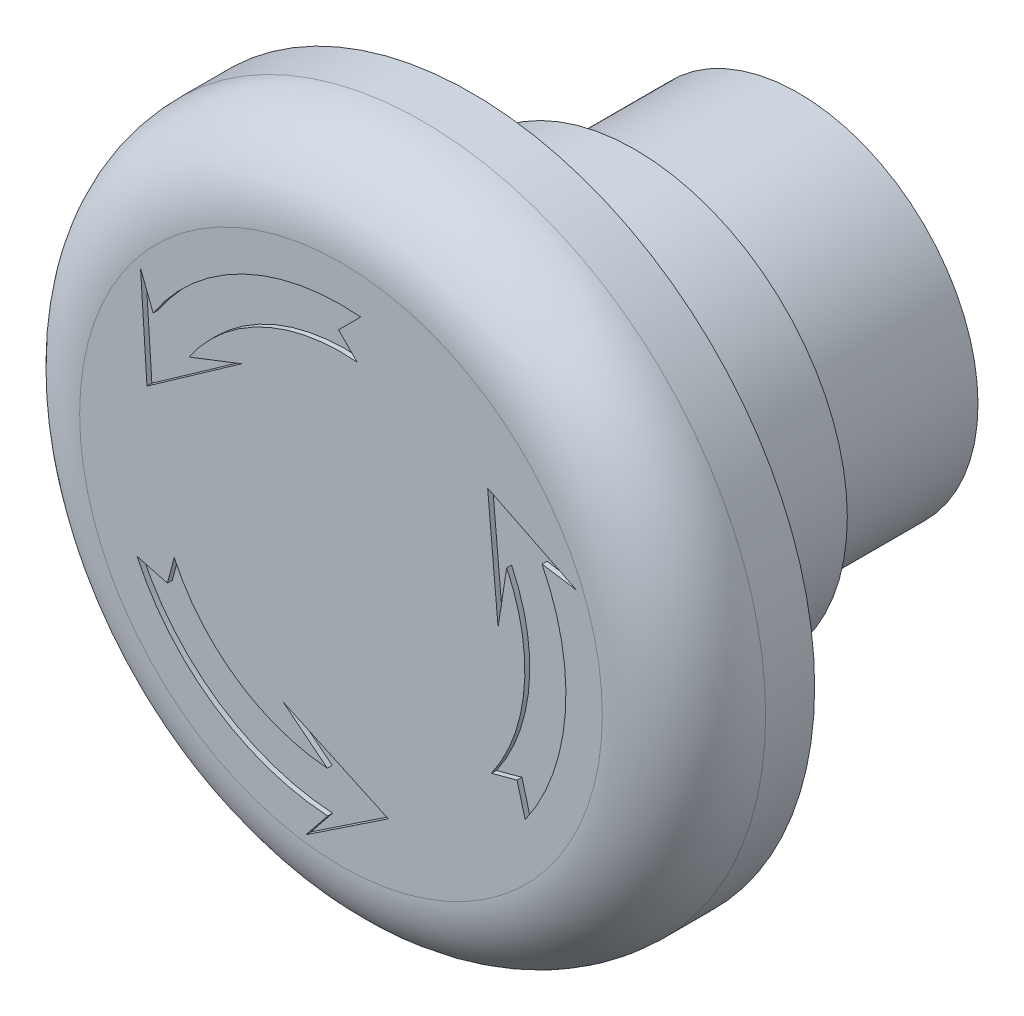
ISO-10303-21;
HEADER;
FILE_DESCRIPTION(('STEP AP214'),'2;1');
FILE_NAME('part.step','',(''),(''),'','','');
FILE_SCHEMA(('AUTOMOTIVE_DESIGN { 1 0 10303 214 1 1 1 1 }'));
ENDSEC;
DATA;
#1=APPLICATION_CONTEXT('core data for automotive mechanical design processes');
#2=APPLICATION_PROTOCOL_DEFINITION('international standard','automotive_design',2000,#1);
#3=PRODUCT_CONTEXT('',#1,'mechanical');
#4=PRODUCT('Part','Part','',(#3));
#5=PRODUCT_RELATED_PRODUCT_CATEGORY('part','',(#4));
#6=PRODUCT_DEFINITION_FORMATION('','',#4);
#7=PRODUCT_DEFINITION_CONTEXT('part definition',#1,'design');
#8=PRODUCT_DEFINITION('design','',#6,#7);
#9=PRODUCT_DEFINITION_SHAPE('','',#8);
#10=(LENGTH_UNIT() NAMED_UNIT(*) SI_UNIT(.MILLI.,.METRE.));
#11=(NAMED_UNIT(*) PLANE_ANGLE_UNIT() SI_UNIT($,.RADIAN.));
#12=(NAMED_UNIT(*) SI_UNIT($,.STERADIAN.) SOLID_ANGLE_UNIT());
#13=UNCERTAINTY_MEASURE_WITH_UNIT(LENGTH_MEASURE(1.E-05),#10,'distance_accuracy_value','');
#14=(GEOMETRIC_REPRESENTATION_CONTEXT(3) GLOBAL_UNCERTAINTY_ASSIGNED_CONTEXT((#13)) GLOBAL_UNIT_ASSIGNED_CONTEXT((#10,
#11,#12)) REPRESENTATION_CONTEXT('',''));
#15=CARTESIAN_POINT('',(0.,0.,0.));
#16=DIRECTION('',(0.,0.,1.));
#17=DIRECTION('',(1.,0.,0.));
#18=AXIS2_PLACEMENT_3D('',#15,#16,#17);
#19=CARTESIAN_POINT('',(0.,0.,10.));
#20=DIRECTION('',(0.,0.,-1.));
#21=DIRECTION('',(-1.,0.,0.));
#22=AXIS2_PLACEMENT_3D('',#19,#20,#21);
#23=CYLINDRICAL_SURFACE('',#22,11.);
#24=CARTESIAN_POINT('',(0.,0.,10.));
#25=DIRECTION('',(0.,0.,1.));
#26=DIRECTION('',(1.,0.,0.));
#27=AXIS2_PLACEMENT_3D('',#24,#25,#26);
#28=CIRCLE('',#27,11.);
#29=CARTESIAN_POINT('',(11.,0.,10.));
#30=VERTEX_POINT('',#29);
#31=EDGE_CURVE('E402',#30,#30,#28,.T.);
#32=ORIENTED_EDGE('',*,*,#31,.F.);
#33=EDGE_LOOP('',(#32));
#34=FACE_BOUND('',#33,.T.);
#35=CARTESIAN_POINT('',(0.,0.,0.));
#36=DIRECTION('',(0.,0.,1.));
#37=DIRECTION('',(1.,0.,0.));
#38=AXIS2_PLACEMENT_3D('',#35,#36,#37);
#39=CIRCLE('',#38,11.);
#40=CARTESIAN_POINT('',(11.,0.,0.));
#41=VERTEX_POINT('',#40);
#42=EDGE_CURVE('E399',#41,#41,#39,.T.);
#43=ORIENTED_EDGE('',*,*,#42,.T.);
#44=EDGE_LOOP('',(#43));
#45=FACE_BOUND('',#44,.T.);
#46=ADVANCED_FACE('F35',(#34,#45),#23,.T.);
#47=CARTESIAN_POINT('',(0.,0.,0.));
#48=DIRECTION('',(0.,0.,1.));
#49=DIRECTION('',(1.,0.,0.));
#50=AXIS2_PLACEMENT_3D('',#47,#48,#49);
#51=PLANE('',#50);
#52=ORIENTED_EDGE('',*,*,#42,.F.);
#53=EDGE_LOOP('',(#52));
#54=FACE_BOUND('',#53,.T.);
#55=ADVANCED_FACE('F426',(#54),#51,.F.);
#56=CARTESIAN_POINT('',(0.,0.,10.));
#57=DIRECTION('',(0.,0.,1.));
#58=DIRECTION('',(1.,0.,0.));
#59=AXIS2_PLACEMENT_3D('',#56,#57,#58);
#60=PLANE('',#59);
#61=CARTESIAN_POINT('',(0.,0.,10.));
#62=DIRECTION('',(0.,0.,1.));
#63=DIRECTION('',(1.,0.,0.));
#64=AXIS2_PLACEMENT_3D('',#61,#62,#63);
#65=CIRCLE('',#64,13.);
#66=CARTESIAN_POINT('',(13.,0.,10.));
#67=VERTEX_POINT('',#66);
#68=EDGE_CURVE('E395',#67,#67,#65,.T.);
#69=ORIENTED_EDGE('',*,*,#68,.F.);
#70=EDGE_LOOP('',(#69));
#71=FACE_BOUND('',#70,.T.);
#72=ORIENTED_EDGE('',*,*,#31,.T.);
#73=EDGE_LOOP('',(#72));
#74=FACE_BOUND('',#73,.T.);
#75=ADVANCED_FACE('F431',(#71,#74),#60,.F.);
#76=CARTESIAN_POINT('',(0.,0.,20.));
#77=DIRECTION('',(0.,0.,-1.));
#78=DIRECTION('',(-1.,0.,0.));
#79=AXIS2_PLACEMENT_3D('',#76,#77,#78);
#80=CYLINDRICAL_SURFACE('',#79,13.);
#81=CARTESIAN_POINT('',(0.,0.,20.));
#82=DIRECTION('',(0.,0.,1.));
#83=DIRECTION('',(1.,0.,0.));
#84=AXIS2_PLACEMENT_3D('',#81,#82,#83);
#85=CIRCLE('',#84,13.);
#86=CARTESIAN_POINT('',(13.,0.,20.));
#87=VERTEX_POINT('',#86);
#88=EDGE_CURVE('E396',#87,#87,#85,.T.);
#89=ORIENTED_EDGE('',*,*,#88,.F.);
#90=EDGE_LOOP('',(#89));
#91=FACE_BOUND('',#90,.T.);
#92=ORIENTED_EDGE('',*,*,#68,.T.);
#93=EDGE_LOOP('',(#92));
#94=FACE_BOUND('',#93,.T.);
#95=ADVANCED_FACE('F437',(#91,#94),#80,.T.);
#96=CARTESIAN_POINT('',(0.,0.,20.));
#97=DIRECTION('',(0.,0.,1.));
#98=DIRECTION('',(1.,0.,0.));
#99=AXIS2_PLACEMENT_3D('',#96,#97,#98);
#100=PLANE('',#99);
#101=CARTESIAN_POINT('',(0.,0.,20.));
#102=DIRECTION('',(0.,0.,1.));
#103=DIRECTION('',(1.,0.,0.));
#104=AXIS2_PLACEMENT_3D('',#101,#102,#103);
#105=CIRCLE('',#104,21.);
#106=CARTESIAN_POINT('',(21.,0.,20.));
#107=VERTEX_POINT('',#106);
#108=EDGE_CURVE('E378',#107,#107,#105,.T.);
#109=ORIENTED_EDGE('',*,*,#108,.F.);
#110=EDGE_LOOP('',(#109));
#111=FACE_BOUND('',#110,.T.);
#112=ORIENTED_EDGE('',*,*,#88,.T.);
#113=EDGE_LOOP('',(#112));
#114=FACE_BOUND('',#113,.T.);
#115=ADVANCED_FACE('F440',(#111,#114),#100,.F.);
#116=CARTESIAN_POINT('',(0.,0.,28.));
#117=DIRECTION('',(0.,0.,-1.));
#118=DIRECTION('',(-1.,0.,0.));
#119=AXIS2_PLACEMENT_3D('',#116,#117,#118);
#120=CYLINDRICAL_SURFACE('',#119,21.);
#121=CARTESIAN_POINT('',(0.,0.,23.));
#122=DIRECTION('',(0.,0.,1.));
#123=DIRECTION('',(1.,0.,0.));
#124=AXIS2_PLACEMENT_3D('',#121,#122,#123);
#125=CIRCLE('',#124,21.);
#126=CARTESIAN_POINT('',(21.,0.,23.));
#127=VERTEX_POINT('',#126);
#128=EDGE_CURVE('E11',#127,#127,#125,.F.);
#129=ORIENTED_EDGE('',*,*,#128,.T.);
#130=EDGE_LOOP('',(#129));
#131=FACE_BOUND('',#130,.T.);
#132=ORIENTED_EDGE('',*,*,#108,.T.);
#133=EDGE_LOOP('',(#132));
#134=FACE_BOUND('',#133,.T.);
#135=ADVANCED_FACE('F421',(#131,#134),#120,.T.);
#136=CARTESIAN_POINT('',(0.,0.,28.));
#137=DIRECTION('',(0.,0.,1.));
#138=DIRECTION('',(1.,0.,0.));
#139=AXIS2_PLACEMENT_3D('',#136,#137,#138);
#140=PLANE('',#139);
#141=CARTESIAN_POINT('',(0.,0.,28.));
#142=DIRECTION('',(0.,0.,-1.));
#143=DIRECTION('',(-0.499999999999992,0.866025403784443,0.));
#144=AXIS2_PLACEMENT_3D('',#141,#142,#143);
#145=CIRCLE('',#144,11.2598367301334);
#146=CARTESIAN_POINT('',(-0.838476735240947,-11.2285742618429,28.));
#147=VERTEX_POINT('',#146);
#148=CARTESIAN_POINT('',(-10.2099834061679,-4.74764805298769,28.));
#149=VERTEX_POINT('',#148);
#150=EDGE_CURVE('E50',#147,#149,#145,.T.);
#151=ORIENTED_EDGE('',*,*,#150,.F.);
#152=DIRECTION('',(0.779913522520548,-0.625887288087553,0.));
#153=VECTOR('',#152,1.);
#154=CARTESIAN_POINT('',(-0.838476735240947,-11.2285742618429,28.));
#155=LINE('',#154,#153);
#156=CARTESIAN_POINT('',(-3.52867193619767,-9.06966954980342,28.));
#157=VERTEX_POINT('',#156);
#158=EDGE_CURVE('E217',#157,#147,#155,.T.);
#159=ORIENTED_EDGE('',*,*,#158,.F.);
#160=DIRECTION('',(-0.907576240052739,0.419887328329557,0.));
#161=VECTOR('',#160,1.);
#162=CARTESIAN_POINT('',(-3.52867193619767,-9.06966954980342,28.));
#163=LINE('',#162,#161);
#164=CARTESIAN_POINT('',(2.89641541698068,-12.042216256021,28.));
#165=VERTEX_POINT('',#164);
#166=EDGE_CURVE('E220',#165,#157,#163,.T.);
#167=ORIENTED_EDGE('',*,*,#166,.F.);
#168=DIRECTION('',(0.831674012425086,0.555264204732088,0.));
#169=VECTOR('',#168,1.);
#170=CARTESIAN_POINT('',(2.89641541698068,-12.042216256021,28.));
#171=LINE('',#170,#169);
#172=CARTESIAN_POINT('',(-2.14435839882373,-15.4076710162406,28.));
#173=VERTEX_POINT('',#172);
#174=EDGE_CURVE('E248',#173,#165,#171,.T.);
#175=ORIENTED_EDGE('',*,*,#174,.F.);
#176=DIRECTION('',(-0.625887288087553,-0.779913522520547,0.));
#177=VECTOR('',#176,1.);
#178=CARTESIAN_POINT('',(-2.14435839882373,-15.4076710162406,28.));
#179=LINE('',#178,#177);
#180=CARTESIAN_POINT('',(-0.812074863862387,-13.7475223528562,28.));
#181=VERTEX_POINT('',#180);
#182=EDGE_CURVE('E245',#181,#173,#179,.T.);
#183=ORIENTED_EDGE('',*,*,#182,.F.);
#184=CARTESIAN_POINT('',(0.,0.,28.));
#185=DIRECTION('',(0.,0.,1.));
#186=DIRECTION('',(-0.499999999999992,0.866025403784443,0.));
#187=AXIS2_PLACEMENT_3D('',#184,#185,#186);
#188=CIRCLE('',#187,13.7714863550308);
#189=CARTESIAN_POINT('',(-12.4835639463824,-5.81502086181822,28.));
#190=VERTEX_POINT('',#189);
#191=EDGE_CURVE('E242',#190,#181,#188,.T.);
#192=ORIENTED_EDGE('',*,*,#191,.F.);
#193=DIRECTION('',(-0.965925826289068,0.258819045102521,0.));
#194=VECTOR('',#193,1.);
#195=CARTESIAN_POINT('',(-12.4835639463824,-5.81502086181822,28.));
#196=LINE('',#195,#194);
#197=CARTESIAN_POINT('',(-10.6291276257949,-6.31191557633456,28.));
#198=VERTEX_POINT('',#197);
#199=EDGE_CURVE('E239',#198,#190,#196,.T.);
#200=ORIENTED_EDGE('',*,*,#199,.F.);
#201=DIRECTION('',(-0.258819045102522,-0.965925826289068,0.));
#202=VECTOR('',#201,1.);
#203=CARTESIAN_POINT('',(-10.6291276257949,-6.31191557633456,28.));
#204=LINE('',#203,#202);
#205=EDGE_CURVE('E237',#149,#198,#204,.T.);
#206=ORIENTED_EDGE('',*,*,#205,.F.);
#207=EDGE_LOOP('',(#151,#159,#167,#175,#183,#192,#200,#206));
#208=FACE_BOUND('',#207,.T.);
#209=CARTESIAN_POINT('',(0.,0.,28.));
#210=DIRECTION('',(0.,0.,-1.));
#211=DIRECTION('',(-0.500000000000004,-0.866025403784436,0.));
#212=AXIS2_PLACEMENT_3D('',#209,#210,#211);
#213=CIRCLE('',#212,11.2598367301334);
#214=CARTESIAN_POINT('',(10.1434689266565,4.88814497772062,28.));
#215=VERTEX_POINT('',#214);
#216=CARTESIAN_POINT('',(9.21657552519905,-6.46828097546511,28.));
#217=VERTEX_POINT('',#216);
#218=EDGE_CURVE('E58',#215,#217,#213,.T.);
#219=ORIENTED_EDGE('',*,*,#218,.F.);
#220=DIRECTION('',(0.152077530129292,0.988368567301578,0.));
#221=VECTOR('',#220,1.);
#222=CARTESIAN_POINT('',(10.1434689266565,4.88814497772062,28.));
#223=LINE('',#222,#221);
#224=CARTESIAN_POINT('',(9.61890020215876,1.47891523653336,28.));
#225=VERTEX_POINT('',#224);
#226=EDGE_CURVE('E270',#225,#215,#223,.T.);
#227=ORIENTED_EDGE('',*,*,#226,.F.);
#228=DIRECTION('',(0.0901550269657999,-0.995927743921614,0.));
#229=VECTOR('',#228,1.);
#230=CARTESIAN_POINT('',(9.61890020215876,1.47891523653336,28.));
#231=LINE('',#230,#229);
#232=CARTESIAN_POINT('',(8.98065748708972,8.5294774590287,28.));
#233=VERTEX_POINT('',#232);
#234=EDGE_CURVE('E308',#233,#225,#231,.T.);
#235=ORIENTED_EDGE('',*,*,#234,.F.);
#236=DIRECTION('',(-0.896709913322697,0.442618720061411,0.));
#237=VECTOR('',#236,1.);
#238=CARTESIAN_POINT('',(8.98065748708972,8.5294774590287,28.));
#239=LINE('',#238,#237);
#240=CARTESIAN_POINT('',(14.4156137126294,5.8467666599205,28.));
#241=VERTEX_POINT('',#240);
#242=EDGE_CURVE('E305',#241,#233,#239,.T.);
#243=ORIENTED_EDGE('',*,*,#242,.F.);
#244=DIRECTION('',(0.988368567301578,-0.152077530129292,0.));
#245=VECTOR('',#244,1.);
#246=CARTESIAN_POINT('',(14.4156137126294,5.8467666599205,28.));
#247=LINE('',#246,#245);
#248=CARTESIAN_POINT('',(12.3117410285991,6.17048371454856,28.));
#249=VERTEX_POINT('',#248);
#250=EDGE_CURVE('E302',#249,#241,#247,.T.);
#251=ORIENTED_EDGE('',*,*,#250,.F.);
#252=CARTESIAN_POINT('',(0.,0.,28.));
#253=DIRECTION('',(0.,0.,1.));
#254=DIRECTION('',(-0.500000000000004,-0.866025403784436,0.));
#255=AXIS2_PLACEMENT_3D('',#252,#253,#254);
#256=CIRCLE('',#255,13.7714863550308);
#257=CARTESIAN_POINT('',(11.2777377630623,-7.9035730764255,28.));
#258=VERTEX_POINT('',#257);
#259=EDGE_CURVE('E299',#258,#249,#256,.T.);
#260=ORIENTED_EDGE('',*,*,#259,.F.);
#261=DIRECTION('',(0.258819045102525,-0.965925826289067,0.));
#262=VECTOR('',#261,1.);
#263=CARTESIAN_POINT('',(11.2777377630623,-7.90357307642549,28.));
#264=LINE('',#263,#262);
#265=CARTESIAN_POINT('',(10.7808430485459,-6.04913675583807,28.));
#266=VERTEX_POINT('',#265);
#267=EDGE_CURVE('E296',#266,#258,#264,.T.);
#268=ORIENTED_EDGE('',*,*,#267,.F.);
#269=DIRECTION('',(0.965925826289068,0.258819045102524,0.));
#270=VECTOR('',#269,1.);
#271=CARTESIAN_POINT('',(10.7808430485459,-6.04913675583807,28.));
#272=LINE('',#271,#270);
#273=EDGE_CURVE('E293',#217,#266,#272,.T.);
#274=ORIENTED_EDGE('',*,*,#273,.F.);
#275=EDGE_LOOP('',(#219,#227,#235,#243,#251,#260,#268,#274));
#276=FACE_BOUND('',#275,.T.);
#277=CARTESIAN_POINT('',(0.,0.,28.));
#278=DIRECTION('',(0.,0.,-1.));
#279=DIRECTION('',(1.,0.,0.));
#280=AXIS2_PLACEMENT_3D('',#277,#278,#279);
#281=CIRCLE('',#280,11.2598367301334);
#282=CARTESIAN_POINT('',(-9.30499219141567,6.34042928412228,28.));
#283=VERTEX_POINT('',#282);
#284=CARTESIAN_POINT('',(0.993407880968791,11.2159290284528,28.));
#285=VERTEX_POINT('',#284);
#286=EDGE_CURVE('E315',#283,#285,#281,.T.);
#287=ORIENTED_EDGE('',*,*,#286,.F.);
#288=DIRECTION('',(-0.931991052649841,-0.362481279214033,0.));
#289=VECTOR('',#288,1.);
#290=CARTESIAN_POINT('',(-9.30499219141567,6.34042928412228,28.));
#291=LINE('',#290,#289);
#292=CARTESIAN_POINT('',(-6.09022826596117,7.59075431327005,28.));
#293=VERTEX_POINT('',#292);
#294=EDGE_CURVE('E333',#293,#283,#291,.T.);
#295=ORIENTED_EDGE('',*,*,#294,.F.);
#296=DIRECTION('',(0.817421213086938,0.576040415592065,0.));
#297=VECTOR('',#296,1.);
#298=CARTESIAN_POINT('',(-6.09022826596117,7.59075431327005,28.));
#299=LINE('',#298,#297);
#300=CARTESIAN_POINT('',(-11.8770729040705,3.51273879699221,28.));
#301=VERTEX_POINT('',#300);
#302=EDGE_CURVE('E371',#301,#293,#299,.T.);
#303=ORIENTED_EDGE('',*,*,#302,.F.);
#304=DIRECTION('',(0.0650359008976182,-0.997882924793502,0.));
#305=VECTOR('',#304,1.);
#306=CARTESIAN_POINT('',(-11.8770729040705,3.51273879699221,28.));
#307=LINE('',#306,#305);
#308=CARTESIAN_POINT('',(-12.2712553138058,9.56090435632007,28.));
#309=VERTEX_POINT('',#308);
#310=EDGE_CURVE('E368',#309,#301,#307,.T.);
#311=ORIENTED_EDGE('',*,*,#310,.F.);
#312=DIRECTION('',(-0.362481279214033,0.931991052649841,0.));
#313=VECTOR('',#312,1.);
#314=CARTESIAN_POINT('',(-12.2712553138058,9.56090435632007,28.));
#315=LINE('',#314,#313);
#316=CARTESIAN_POINT('',(-11.4996661647368,7.57703863830763,28.));
#317=VERTEX_POINT('',#316);
#318=EDGE_CURVE('E365',#317,#309,#315,.T.);
#319=ORIENTED_EDGE('',*,*,#318,.F.);
#320=CARTESIAN_POINT('',(0.,0.,28.));
#321=DIRECTION('',(0.,0.,1.));
#322=DIRECTION('',(1.,0.,0.));
#323=AXIS2_PLACEMENT_3D('',#320,#321,#322);
#324=CIRCLE('',#323,13.7714863550308);
#325=CARTESIAN_POINT('',(1.20582618332,13.7185939382438,28.));
#326=VERTEX_POINT('',#325);
#327=EDGE_CURVE('E362',#326,#317,#324,.T.);
#328=ORIENTED_EDGE('',*,*,#327,.F.);
#329=DIRECTION('',(0.707106781186541,0.707106781186554,0.));
#330=VECTOR('',#329,1.);
#331=CARTESIAN_POINT('',(1.20582618332,13.7185939382438,28.));
#332=LINE('',#331,#330);
#333=CARTESIAN_POINT('',(-0.151715422751066,12.3610523321727,28.));
#334=VERTEX_POINT('',#333);
#335=EDGE_CURVE('E359',#334,#326,#332,.T.);
#336=ORIENTED_EDGE('',*,*,#335,.F.);
#337=DIRECTION('',(-0.707106781186553,0.707106781186542,0.));
#338=VECTOR('',#337,1.);
#339=CARTESIAN_POINT('',(-0.151715422751066,12.3610523321727,28.));
#340=LINE('',#339,#338);
#341=EDGE_CURVE('E356',#285,#334,#340,.T.);
#342=ORIENTED_EDGE('',*,*,#341,.F.);
#343=EDGE_LOOP('',(#287,#295,#303,#311,#319,#328,#336,#342));
#344=FACE_BOUND('',#343,.T.);
#345=CARTESIAN_POINT('',(0.,0.,28.));
#346=DIRECTION('',(0.,0.,1.));
#347=DIRECTION('',(1.,0.,0.));
#348=AXIS2_PLACEMENT_3D('',#345,#346,#347);
#349=CIRCLE('',#348,16.);
#350=CARTESIAN_POINT('',(16.,0.,28.));
#351=VERTEX_POINT('',#350);
#352=EDGE_CURVE('E43',#351,#351,#349,.T.);
#353=ORIENTED_EDGE('',*,*,#352,.T.);
#354=EDGE_LOOP('',(#353));
#355=FACE_BOUND('',#354,.T.);
#356=ADVANCED_FACE('F409',(#208,#276,#344,#355),#140,.T.);
#357=CARTESIAN_POINT('',(0.,0.,23.));
#358=DIRECTION('',(0.,0.,1.));
#359=DIRECTION('',(1.,0.,0.));
#360=AXIS2_PLACEMENT_3D('',#357,#358,#359);
#361=TOROIDAL_SURFACE('',#360,16.,5.);
#362=ORIENTED_EDGE('',*,*,#128,.F.);
#363=EDGE_LOOP('',(#362));
#364=FACE_BOUND('',#363,.T.);
#365=ORIENTED_EDGE('',*,*,#352,.F.);
#366=EDGE_LOOP('',(#365));
#367=FACE_BOUND('',#366,.T.);
#368=ADVANCED_FACE('F37',(#364,#367),#361,.T.);
#369=CARTESIAN_POINT('',(0.,0.,27.7));
#370=DIRECTION('',(0.,0.,1.));
#371=DIRECTION('',(1.,0.,0.));
#372=AXIS2_PLACEMENT_3D('',#369,#370,#371);
#373=CYLINDRICAL_SURFACE('',#372,11.2598367301334);
#374=ORIENTED_EDGE('',*,*,#286,.T.);
#375=DIRECTION('',(0.,0.,1.));
#376=VECTOR('',#375,1.);
#377=CARTESIAN_POINT('',(0.993407880968791,11.2159290284528,27.7));
#378=LINE('',#377,#376);
#379=CARTESIAN_POINT('',(0.993407880968791,11.2159290284528,27.7));
#380=VERTEX_POINT('',#379);
#381=EDGE_CURVE('E354',#380,#285,#378,.T.);
#382=ORIENTED_EDGE('',*,*,#381,.F.);
#383=CARTESIAN_POINT('',(0.,0.,27.7));
#384=DIRECTION('',(0.,0.,-1.));
#385=DIRECTION('',(1.,0.,0.));
#386=AXIS2_PLACEMENT_3D('',#383,#384,#385);
#387=CIRCLE('',#386,11.2598367301334);
#388=CARTESIAN_POINT('',(-9.30499219141567,6.34042928412228,27.7));
#389=VERTEX_POINT('',#388);
#390=EDGE_CURVE('E329',#389,#380,#387,.T.);
#391=ORIENTED_EDGE('',*,*,#390,.F.);
#392=DIRECTION('',(0.,0.,1.));
#393=VECTOR('',#392,1.);
#394=CARTESIAN_POINT('',(-9.30499219141567,6.34042928412228,27.7));
#395=LINE('',#394,#393);
#396=EDGE_CURVE('E376',#389,#283,#395,.T.);
#397=ORIENTED_EDGE('',*,*,#396,.T.);
#398=EDGE_LOOP('',(#374,#382,#391,#397));
#399=FACE_BOUND('',#398,.T.);
#400=ADVANCED_FACE('F412',(#399),#373,.T.);
#401=CARTESIAN_POINT('',(-9.30499219141567,6.34042928412228,27.7));
#402=DIRECTION('',(-0.362481279214033,0.931991052649841,0.));
#403=DIRECTION('',(-0.931991052649841,-0.362481279214033,0.));
#404=AXIS2_PLACEMENT_3D('',#401,#402,#403);
#405=PLANE('',#404);
#406=ORIENTED_EDGE('',*,*,#294,.T.);
#407=ORIENTED_EDGE('',*,*,#396,.F.);
#408=DIRECTION('',(-0.931991052649841,-0.362481279214033,0.));
#409=VECTOR('',#408,1.);
#410=CARTESIAN_POINT('',(-9.30499219141567,6.34042928412228,27.7));
#411=LINE('',#410,#409);
#412=CARTESIAN_POINT('',(-6.09022826596117,7.59075431327005,27.7));
#413=VERTEX_POINT('',#412);
#414=EDGE_CURVE('E351',#413,#389,#411,.T.);
#415=ORIENTED_EDGE('',*,*,#414,.F.);
#416=DIRECTION('',(0.,0.,1.));
#417=VECTOR('',#416,1.);
#418=CARTESIAN_POINT('',(-6.09022826596117,7.59075431327005,27.7));
#419=LINE('',#418,#417);
#420=EDGE_CURVE('E379',#413,#293,#419,.T.);
#421=ORIENTED_EDGE('',*,*,#420,.T.);
#422=EDGE_LOOP('',(#406,#407,#415,#421));
#423=FACE_BOUND('',#422,.T.);
#424=ADVANCED_FACE('F418',(#423),#405,.F.);
#425=CARTESIAN_POINT('',(-6.09022826596117,7.59075431327005,27.7));
#426=DIRECTION('',(0.576040415592065,-0.817421213086938,0.));
#427=DIRECTION('',(0.817421213086938,0.576040415592065,0.));
#428=AXIS2_PLACEMENT_3D('',#425,#426,#427);
#429=PLANE('',#428);
#430=ORIENTED_EDGE('',*,*,#302,.T.);
#431=ORIENTED_EDGE('',*,*,#420,.F.);
#432=DIRECTION('',(0.817421213086938,0.576040415592065,0.));
#433=VECTOR('',#432,1.);
#434=CARTESIAN_POINT('',(-6.09022826596117,7.59075431327005,27.7));
#435=LINE('',#434,#433);
#436=CARTESIAN_POINT('',(-11.8770729040705,3.51273879699221,27.7));
#437=VERTEX_POINT('',#436);
#438=EDGE_CURVE('E348',#437,#413,#435,.T.);
#439=ORIENTED_EDGE('',*,*,#438,.F.);
#440=DIRECTION('',(0.,0.,1.));
#441=VECTOR('',#440,1.);
#442=CARTESIAN_POINT('',(-11.8770729040705,3.51273879699221,27.7));
#443=LINE('',#442,#441);
#444=EDGE_CURVE('E381',#437,#301,#443,.T.);
#445=ORIENTED_EDGE('',*,*,#444,.T.);
#446=EDGE_LOOP('',(#430,#431,#439,#445));
#447=FACE_BOUND('',#446,.T.);
#448=ADVANCED_FACE('F471',(#447),#429,.F.);
#449=CARTESIAN_POINT('',(-11.8770729040705,3.51273879699221,27.7));
#450=DIRECTION('',(-0.997882924793503,-0.0650359008976182,0.));
#451=DIRECTION('',(0.0650359008976182,-0.997882924793503,0.));
#452=AXIS2_PLACEMENT_3D('',#449,#450,#451);
#453=PLANE('',#452);
#454=ORIENTED_EDGE('',*,*,#310,.T.);
#455=ORIENTED_EDGE('',*,*,#444,.F.);
#456=DIRECTION('',(0.0650359008976182,-0.997882924793502,0.));
#457=VECTOR('',#456,1.);
#458=CARTESIAN_POINT('',(-11.8770729040705,3.51273879699221,27.7));
#459=LINE('',#458,#457);
#460=CARTESIAN_POINT('',(-12.2712553138058,9.56090435632007,27.7));
#461=VERTEX_POINT('',#460);
#462=EDGE_CURVE('E345',#461,#437,#459,.T.);
#463=ORIENTED_EDGE('',*,*,#462,.F.);
#464=DIRECTION('',(0.,0.,1.));
#465=VECTOR('',#464,1.);
#466=CARTESIAN_POINT('',(-12.2712553138058,9.56090435632007,27.7));
#467=LINE('',#466,#465);
#468=EDGE_CURVE('E383',#461,#309,#467,.T.);
#469=ORIENTED_EDGE('',*,*,#468,.T.);
#470=EDGE_LOOP('',(#454,#455,#463,#469));
#471=FACE_BOUND('',#470,.T.);
#472=ADVANCED_FACE('F467',(#471),#453,.F.);
#473=CARTESIAN_POINT('',(-12.2712553138058,9.56090435632007,27.7));
#474=DIRECTION('',(0.931991052649841,0.362481279214033,0.));
#475=DIRECTION('',(-0.362481279214033,0.931991052649841,0.));
#476=AXIS2_PLACEMENT_3D('',#473,#474,#475);
#477=PLANE('',#476);
#478=ORIENTED_EDGE('',*,*,#318,.T.);
#479=ORIENTED_EDGE('',*,*,#468,.F.);
#480=DIRECTION('',(-0.362481279214033,0.931991052649841,0.));
#481=VECTOR('',#480,1.);
#482=CARTESIAN_POINT('',(-12.2712553138058,9.56090435632007,27.7));
#483=LINE('',#482,#481);
#484=CARTESIAN_POINT('',(-11.4996661647368,7.57703863830763,27.7));
#485=VERTEX_POINT('',#484);
#486=EDGE_CURVE('E342',#485,#461,#483,.T.);
#487=ORIENTED_EDGE('',*,*,#486,.F.);
#488=DIRECTION('',(0.,0.,1.));
#489=VECTOR('',#488,1.);
#490=CARTESIAN_POINT('',(-11.4996661647368,7.57703863830763,27.7));
#491=LINE('',#490,#489);
#492=EDGE_CURVE('E385',#485,#317,#491,.T.);
#493=ORIENTED_EDGE('',*,*,#492,.T.);
#494=EDGE_LOOP('',(#478,#479,#487,#493));
#495=FACE_BOUND('',#494,.T.);
#496=ADVANCED_FACE('F463',(#495),#477,.F.);
#497=CARTESIAN_POINT('',(0.,0.,27.7));
#498=DIRECTION('',(0.,0.,1.));
#499=DIRECTION('',(1.,0.,0.));
#500=AXIS2_PLACEMENT_3D('',#497,#498,#499);
#501=CYLINDRICAL_SURFACE('',#500,13.7714863550308);
#502=ORIENTED_EDGE('',*,*,#327,.T.);
#503=ORIENTED_EDGE('',*,*,#492,.F.);
#504=CARTESIAN_POINT('',(0.,0.,27.7));
#505=DIRECTION('',(0.,0.,1.));
#506=DIRECTION('',(1.,0.,0.));
#507=AXIS2_PLACEMENT_3D('',#504,#505,#506);
#508=CIRCLE('',#507,13.7714863550308);
#509=CARTESIAN_POINT('',(1.20582618332,13.7185939382438,27.7));
#510=VERTEX_POINT('',#509);
#511=EDGE_CURVE('E339',#510,#485,#508,.T.);
#512=ORIENTED_EDGE('',*,*,#511,.F.);
#513=DIRECTION('',(0.,0.,1.));
#514=VECTOR('',#513,1.);
#515=CARTESIAN_POINT('',(1.20582618332,13.7185939382438,27.7));
#516=LINE('',#515,#514);
#517=EDGE_CURVE('E387',#510,#326,#516,.T.);
#518=ORIENTED_EDGE('',*,*,#517,.T.);
#519=EDGE_LOOP('',(#502,#503,#512,#518));
#520=FACE_BOUND('',#519,.T.);
#521=ADVANCED_FACE('F459',(#520),#501,.F.);
#522=CARTESIAN_POINT('',(1.20582618332,13.7185939382438,27.7));
#523=DIRECTION('',(0.707106781186554,-0.707106781186541,0.));
#524=DIRECTION('',(0.707106781186541,0.707106781186554,0.));
#525=AXIS2_PLACEMENT_3D('',#522,#523,#524);
#526=PLANE('',#525);
#527=ORIENTED_EDGE('',*,*,#335,.T.);
#528=ORIENTED_EDGE('',*,*,#517,.F.);
#529=DIRECTION('',(0.707106781186541,0.707106781186554,0.));
#530=VECTOR('',#529,1.);
#531=CARTESIAN_POINT('',(1.20582618332,13.7185939382438,27.7));
#532=LINE('',#531,#530);
#533=CARTESIAN_POINT('',(-0.151715422751066,12.3610523321727,27.7));
#534=VERTEX_POINT('',#533);
#535=EDGE_CURVE('E336',#534,#510,#532,.T.);
#536=ORIENTED_EDGE('',*,*,#535,.F.);
#537=DIRECTION('',(0.,0.,1.));
#538=VECTOR('',#537,1.);
#539=CARTESIAN_POINT('',(-0.151715422751066,12.3610523321727,27.7));
#540=LINE('',#539,#538);
#541=EDGE_CURVE('E389',#534,#334,#540,.T.);
#542=ORIENTED_EDGE('',*,*,#541,.T.);
#543=EDGE_LOOP('',(#527,#528,#536,#542));
#544=FACE_BOUND('',#543,.T.);
#545=ADVANCED_FACE('F455',(#544),#526,.F.);
#546=CARTESIAN_POINT('',(-0.151715422751066,12.3610523321727,27.7));
#547=DIRECTION('',(0.707106781186542,0.707106781186553,0.));
#548=DIRECTION('',(-0.707106781186553,0.707106781186542,0.));
#549=AXIS2_PLACEMENT_3D('',#546,#547,#548);
#550=PLANE('',#549);
#551=ORIENTED_EDGE('',*,*,#341,.T.);
#552=ORIENTED_EDGE('',*,*,#541,.F.);
#553=DIRECTION('',(-0.707106781186553,0.707106781186542,0.));
#554=VECTOR('',#553,1.);
#555=CARTESIAN_POINT('',(-0.151715422751066,12.3610523321727,27.7));
#556=LINE('',#555,#554);
#557=EDGE_CURVE('E332',#380,#534,#556,.T.);
#558=ORIENTED_EDGE('',*,*,#557,.F.);
#559=ORIENTED_EDGE('',*,*,#381,.T.);
#560=EDGE_LOOP('',(#551,#552,#558,#559));
#561=FACE_BOUND('',#560,.T.);
#562=ADVANCED_FACE('F451',(#561),#550,.F.);
#563=CARTESIAN_POINT('',(0.,0.,27.7));
#564=DIRECTION('',(0.,0.,1.));
#565=DIRECTION('',(1.,0.,0.));
#566=AXIS2_PLACEMENT_3D('',#563,#564,#565);
#567=PLANE('',#566);
#568=ORIENTED_EDGE('',*,*,#390,.T.);
#569=ORIENTED_EDGE('',*,*,#557,.T.);
#570=ORIENTED_EDGE('',*,*,#535,.T.);
#571=ORIENTED_EDGE('',*,*,#511,.T.);
#572=ORIENTED_EDGE('',*,*,#486,.T.);
#573=ORIENTED_EDGE('',*,*,#462,.T.);
#574=ORIENTED_EDGE('',*,*,#438,.T.);
#575=ORIENTED_EDGE('',*,*,#414,.T.);
#576=EDGE_LOOP('',(#568,#569,#570,#571,#572,#573,#574,#575));
#577=FACE_BOUND('',#576,.T.);
#578=ADVANCED_FACE('F454',(#577),#567,.T.);
#579=CARTESIAN_POINT('',(0.,0.,27.7));
#580=DIRECTION('',(0.,0.,1.));
#581=DIRECTION('',(1.,0.,0.));
#582=AXIS2_PLACEMENT_3D('',#579,#580,#581);
#583=CYLINDRICAL_SURFACE('',#582,11.2598367301334);
#584=ORIENTED_EDGE('',*,*,#218,.T.);
#585=DIRECTION('',(0.,0.,1.));
#586=VECTOR('',#585,1.);
#587=CARTESIAN_POINT('',(9.21657552519905,-6.4682809754651,27.7));
#588=LINE('',#587,#586);
#589=CARTESIAN_POINT('',(9.21657552519905,-6.4682809754651,27.7));
#590=VERTEX_POINT('',#589);
#591=EDGE_CURVE('E291',#590,#217,#588,.T.);
#592=ORIENTED_EDGE('',*,*,#591,.F.);
#593=CARTESIAN_POINT('',(0.,0.,27.7));
#594=DIRECTION('',(0.,0.,-1.));
#595=DIRECTION('',(-0.500000000000004,-0.866025403784436,0.));
#596=AXIS2_PLACEMENT_3D('',#593,#594,#595);
#597=CIRCLE('',#596,11.2598367301334);
#598=CARTESIAN_POINT('',(10.1434689266565,4.88814497772062,27.7));
#599=VERTEX_POINT('',#598);
#600=EDGE_CURVE('E266',#599,#590,#597,.T.);
#601=ORIENTED_EDGE('',*,*,#600,.F.);
#602=DIRECTION('',(0.,0.,1.));
#603=VECTOR('',#602,1.);
#604=CARTESIAN_POINT('',(10.1434689266565,4.88814497772062,27.7));
#605=LINE('',#604,#603);
#606=EDGE_CURVE('E313',#599,#215,#605,.T.);
#607=ORIENTED_EDGE('',*,*,#606,.T.);
#608=EDGE_LOOP('',(#584,#592,#601,#607));
#609=FACE_BOUND('',#608,.T.);
#610=ADVANCED_FACE('F481',(#609),#583,.T.);
#611=CARTESIAN_POINT('',(10.1434689266565,4.88814497772062,27.7));
#612=DIRECTION('',(0.988368567301578,-0.152077530129292,0.));
#613=DIRECTION('',(0.152077530129292,0.988368567301578,0.));
#614=AXIS2_PLACEMENT_3D('',#611,#612,#613);
#615=PLANE('',#614);
#616=ORIENTED_EDGE('',*,*,#226,.T.);
#617=ORIENTED_EDGE('',*,*,#606,.F.);
#618=DIRECTION('',(0.152077530129292,0.988368567301578,0.));
#619=VECTOR('',#618,1.);
#620=CARTESIAN_POINT('',(10.1434689266565,4.88814497772062,27.7));
#621=LINE('',#620,#619);
#622=CARTESIAN_POINT('',(9.61890020215876,1.47891523653336,27.7));
#623=VERTEX_POINT('',#622);
#624=EDGE_CURVE('E288',#623,#599,#621,.T.);
#625=ORIENTED_EDGE('',*,*,#624,.F.);
#626=DIRECTION('',(0.,0.,1.));
#627=VECTOR('',#626,1.);
#628=CARTESIAN_POINT('',(9.61890020215876,1.47891523653336,27.7));
#629=LINE('',#628,#627);
#630=EDGE_CURVE('E316',#623,#225,#629,.T.);
#631=ORIENTED_EDGE('',*,*,#630,.T.);
#632=EDGE_LOOP('',(#616,#617,#625,#631));
#633=FACE_BOUND('',#632,.T.);
#634=ADVANCED_FACE('F485',(#633),#615,.F.);
#635=CARTESIAN_POINT('',(9.61890020215876,1.47891523653336,27.7));
#636=DIRECTION('',(-0.995927743921614,-0.0901550269657999,0.));
#637=DIRECTION('',(0.0901550269657999,-0.995927743921614,0.));
#638=AXIS2_PLACEMENT_3D('',#635,#636,#637);
#639=PLANE('',#638);
#640=ORIENTED_EDGE('',*,*,#234,.T.);
#641=ORIENTED_EDGE('',*,*,#630,.F.);
#642=DIRECTION('',(0.0901550269657999,-0.995927743921614,0.));
#643=VECTOR('',#642,1.);
#644=CARTESIAN_POINT('',(9.61890020215876,1.47891523653336,27.7));
#645=LINE('',#644,#643);
#646=CARTESIAN_POINT('',(8.98065748708972,8.5294774590287,27.7));
#647=VERTEX_POINT('',#646);
#648=EDGE_CURVE('E285',#647,#623,#645,.T.);
#649=ORIENTED_EDGE('',*,*,#648,.F.);
#650=DIRECTION('',(0.,0.,1.));
#651=VECTOR('',#650,1.);
#652=CARTESIAN_POINT('',(8.98065748708972,8.5294774590287,27.7));
#653=LINE('',#652,#651);
#654=EDGE_CURVE('E318',#647,#233,#653,.T.);
#655=ORIENTED_EDGE('',*,*,#654,.T.);
#656=EDGE_LOOP('',(#640,#641,#649,#655));
#657=FACE_BOUND('',#656,.T.);
#658=ADVANCED_FACE('F506',(#657),#639,.F.);
#659=CARTESIAN_POINT('',(8.98065748708972,8.5294774590287,27.7));
#660=DIRECTION('',(0.442618720061411,0.896709913322697,0.));
#661=DIRECTION('',(-0.896709913322697,0.442618720061411,0.));
#662=AXIS2_PLACEMENT_3D('',#659,#660,#661);
#663=PLANE('',#662);
#664=ORIENTED_EDGE('',*,*,#242,.T.);
#665=ORIENTED_EDGE('',*,*,#654,.F.);
#666=DIRECTION('',(-0.896709913322697,0.442618720061411,0.));
#667=VECTOR('',#666,1.);
#668=CARTESIAN_POINT('',(8.98065748708972,8.5294774590287,27.7));
#669=LINE('',#668,#667);
#670=CARTESIAN_POINT('',(14.4156137126294,5.8467666599205,27.7));
#671=VERTEX_POINT('',#670);
#672=EDGE_CURVE('E282',#671,#647,#669,.T.);
#673=ORIENTED_EDGE('',*,*,#672,.F.);
#674=DIRECTION('',(0.,0.,1.));
#675=VECTOR('',#674,1.);
#676=CARTESIAN_POINT('',(14.4156137126294,5.8467666599205,27.7));
#677=LINE('',#676,#675);
#678=EDGE_CURVE('E320',#671,#241,#677,.T.);
#679=ORIENTED_EDGE('',*,*,#678,.T.);
#680=EDGE_LOOP('',(#664,#665,#673,#679));
#681=FACE_BOUND('',#680,.T.);
#682=ADVANCED_FACE('F502',(#681),#663,.F.);
#683=CARTESIAN_POINT('',(14.4156137126294,5.8467666599205,27.7));
#684=DIRECTION('',(-0.152077530129292,-0.988368567301578,0.));
#685=DIRECTION('',(0.988368567301578,-0.152077530129292,0.));
#686=AXIS2_PLACEMENT_3D('',#683,#684,#685);
#687=PLANE('',#686);
#688=ORIENTED_EDGE('',*,*,#250,.T.);
#689=ORIENTED_EDGE('',*,*,#678,.F.);
#690=DIRECTION('',(0.988368567301578,-0.152077530129292,0.));
#691=VECTOR('',#690,1.);
#692=CARTESIAN_POINT('',(14.4156137126294,5.8467666599205,27.7));
#693=LINE('',#692,#691);
#694=CARTESIAN_POINT('',(12.3117410285991,6.17048371454856,27.7));
#695=VERTEX_POINT('',#694);
#696=EDGE_CURVE('E279',#695,#671,#693,.T.);
#697=ORIENTED_EDGE('',*,*,#696,.F.);
#698=DIRECTION('',(0.,0.,1.));
#699=VECTOR('',#698,1.);
#700=CARTESIAN_POINT('',(12.3117410285991,6.17048371454856,27.7));
#701=LINE('',#700,#699);
#702=EDGE_CURVE('E322',#695,#249,#701,.T.);
#703=ORIENTED_EDGE('',*,*,#702,.T.);
#704=EDGE_LOOP('',(#688,#689,#697,#703));
#705=FACE_BOUND('',#704,.T.);
#706=ADVANCED_FACE('F498',(#705),#687,.F.);
#707=CARTESIAN_POINT('',(0.,0.,27.7));
#708=DIRECTION('',(0.,0.,1.));
#709=DIRECTION('',(1.,0.,0.));
#710=AXIS2_PLACEMENT_3D('',#707,#708,#709);
#711=CYLINDRICAL_SURFACE('',#710,13.7714863550308);
#712=ORIENTED_EDGE('',*,*,#259,.T.);
#713=ORIENTED_EDGE('',*,*,#702,.F.);
#714=CARTESIAN_POINT('',(0.,0.,27.7));
#715=DIRECTION('',(0.,0.,1.));
#716=DIRECTION('',(-0.500000000000004,-0.866025403784436,0.));
#717=AXIS2_PLACEMENT_3D('',#714,#715,#716);
#718=CIRCLE('',#717,13.7714863550308);
#719=CARTESIAN_POINT('',(11.2777377630623,-7.9035730764255,27.7));
#720=VERTEX_POINT('',#719);
#721=EDGE_CURVE('E276',#720,#695,#718,.T.);
#722=ORIENTED_EDGE('',*,*,#721,.F.);
#723=DIRECTION('',(0.,0.,1.));
#724=VECTOR('',#723,1.);
#725=CARTESIAN_POINT('',(11.2777377630623,-7.9035730764255,27.7));
#726=LINE('',#725,#724);
#727=EDGE_CURVE('E324',#720,#258,#726,.T.);
#728=ORIENTED_EDGE('',*,*,#727,.T.);
#729=EDGE_LOOP('',(#712,#713,#722,#728));
#730=FACE_BOUND('',#729,.T.);
#731=ADVANCED_FACE('F494',(#730),#711,.F.);
#732=CARTESIAN_POINT('',(11.2777377630623,-7.90357307642549,27.7));
#733=DIRECTION('',(-0.965925826289067,-0.258819045102525,0.));
#734=DIRECTION('',(0.258819045102525,-0.965925826289067,0.));
#735=AXIS2_PLACEMENT_3D('',#732,#733,#734);
#736=PLANE('',#735);
#737=ORIENTED_EDGE('',*,*,#267,.T.);
#738=ORIENTED_EDGE('',*,*,#727,.F.);
#739=DIRECTION('',(0.258819045102525,-0.965925826289067,0.));
#740=VECTOR('',#739,1.);
#741=CARTESIAN_POINT('',(11.2777377630623,-7.90357307642549,27.7));
#742=LINE('',#741,#740);
#743=CARTESIAN_POINT('',(10.7808430485459,-6.04913675583807,27.7));
#744=VERTEX_POINT('',#743);
#745=EDGE_CURVE('E273',#744,#720,#742,.T.);
#746=ORIENTED_EDGE('',*,*,#745,.F.);
#747=DIRECTION('',(0.,0.,1.));
#748=VECTOR('',#747,1.);
#749=CARTESIAN_POINT('',(10.7808430485459,-6.04913675583807,27.7));
#750=LINE('',#749,#748);
#751=EDGE_CURVE('E326',#744,#266,#750,.T.);
#752=ORIENTED_EDGE('',*,*,#751,.T.);
#753=EDGE_LOOP('',(#737,#738,#746,#752));
#754=FACE_BOUND('',#753,.T.);
#755=ADVANCED_FACE('F490',(#754),#736,.F.);
#756=CARTESIAN_POINT('',(10.7808430485459,-6.04913675583807,27.7));
#757=DIRECTION('',(0.258819045102524,-0.965925826289067,0.));
#758=DIRECTION('',(0.965925826289067,0.258819045102524,0.));
#759=AXIS2_PLACEMENT_3D('',#756,#757,#758);
#760=PLANE('',#759);
#761=ORIENTED_EDGE('',*,*,#273,.T.);
#762=ORIENTED_EDGE('',*,*,#751,.F.);
#763=DIRECTION('',(0.965925826289068,0.258819045102524,0.));
#764=VECTOR('',#763,1.);
#765=CARTESIAN_POINT('',(10.7808430485459,-6.04913675583807,27.7));
#766=LINE('',#765,#764);
#767=EDGE_CURVE('E269',#590,#744,#766,.T.);
#768=ORIENTED_EDGE('',*,*,#767,.F.);
#769=ORIENTED_EDGE('',*,*,#591,.T.);
#770=EDGE_LOOP('',(#761,#762,#768,#769));
#771=FACE_BOUND('',#770,.T.);
#772=ADVANCED_FACE('F486',(#771),#760,.F.);
#773=CARTESIAN_POINT('',(0.,0.,27.7));
#774=DIRECTION('',(0.,0.,1.));
#775=DIRECTION('',(-0.500000000000004,-0.866025403784436,0.));
#776=AXIS2_PLACEMENT_3D('',#773,#774,#775);
#777=PLANE('',#776);
#778=ORIENTED_EDGE('',*,*,#600,.T.);
#779=ORIENTED_EDGE('',*,*,#767,.T.);
#780=ORIENTED_EDGE('',*,*,#745,.T.);
#781=ORIENTED_EDGE('',*,*,#721,.T.);
#782=ORIENTED_EDGE('',*,*,#696,.T.);
#783=ORIENTED_EDGE('',*,*,#672,.T.);
#784=ORIENTED_EDGE('',*,*,#648,.T.);
#785=ORIENTED_EDGE('',*,*,#624,.T.);
#786=EDGE_LOOP('',(#778,#779,#780,#781,#782,#783,#784,#785));
#787=FACE_BOUND('',#786,.T.);
#788=ADVANCED_FACE('F489',(#787),#777,.T.);
#789=CARTESIAN_POINT('',(0.,0.,27.7));
#790=DIRECTION('',(0.,0.,1.));
#791=DIRECTION('',(1.,0.,0.));
#792=AXIS2_PLACEMENT_3D('',#789,#790,#791);
#793=CYLINDRICAL_SURFACE('',#792,11.2598367301334);
#794=ORIENTED_EDGE('',*,*,#150,.T.);
#795=DIRECTION('',(0.,0.,1.));
#796=VECTOR('',#795,1.);
#797=CARTESIAN_POINT('',(-10.2099834061679,-4.74764805298768,27.7));
#798=LINE('',#797,#796);
#799=CARTESIAN_POINT('',(-10.2099834061679,-4.74764805298768,27.7));
#800=VERTEX_POINT('',#799);
#801=EDGE_CURVE('E194',#800,#149,#798,.T.);
#802=ORIENTED_EDGE('',*,*,#801,.F.);
#803=CARTESIAN_POINT('',(0.,0.,27.7));
#804=DIRECTION('',(0.,0.,-1.));
#805=DIRECTION('',(-0.499999999999992,0.866025403784443,0.));
#806=AXIS2_PLACEMENT_3D('',#803,#804,#805);
#807=CIRCLE('',#806,11.2598367301334);
#808=CARTESIAN_POINT('',(-0.838476735240947,-11.2285742618429,27.7));
#809=VERTEX_POINT('',#808);
#810=EDGE_CURVE('E198',#809,#800,#807,.T.);
#811=ORIENTED_EDGE('',*,*,#810,.F.);
#812=DIRECTION('',(0.,0.,1.));
#813=VECTOR('',#812,1.);
#814=CARTESIAN_POINT('',(-0.838476735240947,-11.2285742618429,27.7));
#815=LINE('',#814,#813);
#816=EDGE_CURVE('E253',#809,#147,#815,.T.);
#817=ORIENTED_EDGE('',*,*,#816,.T.);
#818=EDGE_LOOP('',(#794,#802,#811,#817));
#819=FACE_BOUND('',#818,.T.);
#820=ADVANCED_FACE('F196',(#819),#793,.T.);
#821=CARTESIAN_POINT('',(-0.838476735240947,-11.2285742618429,27.7));
#822=DIRECTION('',(-0.625887288087553,-0.779913522520547,0.));
#823=DIRECTION('',(0.779913522520548,-0.625887288087553,0.));
#824=AXIS2_PLACEMENT_3D('',#821,#822,#823);
#825=PLANE('',#824);
#826=ORIENTED_EDGE('',*,*,#158,.T.);
#827=ORIENTED_EDGE('',*,*,#816,.F.);
#828=DIRECTION('',(0.779913522520548,-0.625887288087553,0.));
#829=VECTOR('',#828,1.);
#830=CARTESIAN_POINT('',(-0.838476735240947,-11.2285742618429,27.7));
#831=LINE('',#830,#829);
#832=CARTESIAN_POINT('',(-3.52867193619767,-9.06966954980342,27.7));
#833=VERTEX_POINT('',#832);
#834=EDGE_CURVE('E204',#833,#809,#831,.T.);
#835=ORIENTED_EDGE('',*,*,#834,.F.);
#836=DIRECTION('',(0.,0.,1.));
#837=VECTOR('',#836,1.);
#838=CARTESIAN_POINT('',(-3.52867193619767,-9.06966954980342,27.7));
#839=LINE('',#838,#837);
#840=EDGE_CURVE('E255',#833,#157,#839,.T.);
#841=ORIENTED_EDGE('',*,*,#840,.T.);
#842=EDGE_LOOP('',(#826,#827,#835,#841));
#843=FACE_BOUND('',#842,.T.);
#844=ADVANCED_FACE('F519',(#843),#825,.F.);
#845=CARTESIAN_POINT('',(-3.52867193619767,-9.06966954980342,27.7));
#846=DIRECTION('',(0.419887328329557,0.907576240052739,0.));
#847=DIRECTION('',(-0.907576240052739,0.419887328329558,0.));
#848=AXIS2_PLACEMENT_3D('',#845,#846,#847);
#849=PLANE('',#848);
#850=ORIENTED_EDGE('',*,*,#166,.T.);
#851=ORIENTED_EDGE('',*,*,#840,.F.);
#852=DIRECTION('',(-0.907576240052739,0.419887328329557,0.));
#853=VECTOR('',#852,1.);
#854=CARTESIAN_POINT('',(-3.52867193619767,-9.06966954980342,27.7));
#855=LINE('',#854,#853);
#856=CARTESIAN_POINT('',(2.89641541698068,-12.042216256021,27.7));
#857=VERTEX_POINT('',#856);
#858=EDGE_CURVE('E233',#857,#833,#855,.T.);
#859=ORIENTED_EDGE('',*,*,#858,.F.);
#860=DIRECTION('',(0.,0.,1.));
#861=VECTOR('',#860,1.);
#862=CARTESIAN_POINT('',(2.89641541698068,-12.042216256021,27.7));
#863=LINE('',#862,#861);
#864=EDGE_CURVE('E257',#857,#165,#863,.T.);
#865=ORIENTED_EDGE('',*,*,#864,.T.);
#866=EDGE_LOOP('',(#850,#851,#859,#865));
#867=FACE_BOUND('',#866,.T.);
#868=ADVANCED_FACE('F537',(#867),#849,.F.);
#869=CARTESIAN_POINT('',(2.89641541698068,-12.042216256021,27.7));
#870=DIRECTION('',(0.555264204732088,-0.831674012425086,0.));
#871=DIRECTION('',(0.831674012425086,0.555264204732088,0.));
#872=AXIS2_PLACEMENT_3D('',#869,#870,#871);
#873=PLANE('',#872);
#874=ORIENTED_EDGE('',*,*,#174,.T.);
#875=ORIENTED_EDGE('',*,*,#864,.F.);
#876=DIRECTION('',(0.831674012425086,0.555264204732088,0.));
#877=VECTOR('',#876,1.);
#878=CARTESIAN_POINT('',(2.89641541698068,-12.042216256021,27.7));
#879=LINE('',#878,#877);
#880=CARTESIAN_POINT('',(-2.14435839882373,-15.4076710162406,27.7));
#881=VERTEX_POINT('',#880);
#882=EDGE_CURVE('E230',#881,#857,#879,.T.);
#883=ORIENTED_EDGE('',*,*,#882,.F.);
#884=DIRECTION('',(0.,0.,1.));
#885=VECTOR('',#884,1.);
#886=CARTESIAN_POINT('',(-2.14435839882373,-15.4076710162406,27.7));
#887=LINE('',#886,#885);
#888=EDGE_CURVE('E259',#881,#173,#887,.T.);
#889=ORIENTED_EDGE('',*,*,#888,.T.);
#890=EDGE_LOOP('',(#874,#875,#883,#889));
#891=FACE_BOUND('',#890,.T.);
#892=ADVANCED_FACE('F533',(#891),#873,.F.);
#893=CARTESIAN_POINT('',(-2.14435839882373,-15.4076710162406,27.7));
#894=DIRECTION('',(-0.779913522520548,0.625887288087553,0.));
#895=DIRECTION('',(-0.625887288087553,-0.779913522520548,0.));
#896=AXIS2_PLACEMENT_3D('',#893,#894,#895);
#897=PLANE('',#896);
#898=ORIENTED_EDGE('',*,*,#182,.T.);
#899=ORIENTED_EDGE('',*,*,#888,.F.);
#900=DIRECTION('',(-0.625887288087553,-0.779913522520547,0.));
#901=VECTOR('',#900,1.);
#902=CARTESIAN_POINT('',(-2.14435839882373,-15.4076710162406,27.7));
#903=LINE('',#902,#901);
#904=CARTESIAN_POINT('',(-0.812074863862387,-13.7475223528562,27.7));
#905=VERTEX_POINT('',#904);
#906=EDGE_CURVE('E227',#905,#881,#903,.T.);
#907=ORIENTED_EDGE('',*,*,#906,.F.);
#908=DIRECTION('',(0.,0.,1.));
#909=VECTOR('',#908,1.);
#910=CARTESIAN_POINT('',(-0.812074863862387,-13.7475223528562,27.7));
#911=LINE('',#910,#909);
#912=EDGE_CURVE('E261',#905,#181,#911,.T.);
#913=ORIENTED_EDGE('',*,*,#912,.T.);
#914=EDGE_LOOP('',(#898,#899,#907,#913));
#915=FACE_BOUND('',#914,.T.);
#916=ADVANCED_FACE('F529',(#915),#897,.F.);
#917=CARTESIAN_POINT('',(0.,0.,27.7));
#918=DIRECTION('',(0.,0.,1.));
#919=DIRECTION('',(1.,0.,0.));
#920=AXIS2_PLACEMENT_3D('',#917,#918,#919);
#921=CYLINDRICAL_SURFACE('',#920,13.7714863550308);
#922=ORIENTED_EDGE('',*,*,#191,.T.);
#923=ORIENTED_EDGE('',*,*,#912,.F.);
#924=CARTESIAN_POINT('',(0.,0.,27.7));
#925=DIRECTION('',(0.,0.,1.));
#926=DIRECTION('',(-0.499999999999992,0.866025403784443,0.));
#927=AXIS2_PLACEMENT_3D('',#924,#925,#926);
#928=CIRCLE('',#927,13.7714863550308);
#929=CARTESIAN_POINT('',(-12.4835639463824,-5.81502086181822,27.7));
#930=VERTEX_POINT('',#929);
#931=EDGE_CURVE('E224',#930,#905,#928,.T.);
#932=ORIENTED_EDGE('',*,*,#931,.F.);
#933=DIRECTION('',(0.,0.,1.));
#934=VECTOR('',#933,1.);
#935=CARTESIAN_POINT('',(-12.4835639463824,-5.81502086181822,27.7));
#936=LINE('',#935,#934);
#937=EDGE_CURVE('E263',#930,#190,#936,.T.);
#938=ORIENTED_EDGE('',*,*,#937,.T.);
#939=EDGE_LOOP('',(#922,#923,#932,#938));
#940=FACE_BOUND('',#939,.T.);
#941=ADVANCED_FACE('F525',(#940),#921,.F.);
#942=CARTESIAN_POINT('',(-12.4835639463824,-5.81502086181822,27.7));
#943=DIRECTION('',(0.258819045102521,0.965925826289068,0.));
#944=DIRECTION('',(-0.965925826289068,0.258819045102521,0.));
#945=AXIS2_PLACEMENT_3D('',#942,#943,#944);
#946=PLANE('',#945);
#947=ORIENTED_EDGE('',*,*,#199,.T.);
#948=ORIENTED_EDGE('',*,*,#937,.F.);
#949=DIRECTION('',(-0.965925826289068,0.258819045102521,0.));
#950=VECTOR('',#949,1.);
#951=CARTESIAN_POINT('',(-12.4835639463824,-5.81502086181822,27.7));
#952=LINE('',#951,#950);
#953=CARTESIAN_POINT('',(-10.6291276257949,-6.31191557633456,27.7));
#954=VERTEX_POINT('',#953);
#955=EDGE_CURVE('E212',#954,#930,#952,.T.);
#956=ORIENTED_EDGE('',*,*,#955,.F.);
#957=DIRECTION('',(0.,0.,1.));
#958=VECTOR('',#957,1.);
#959=CARTESIAN_POINT('',(-10.6291276257949,-6.31191557633456,27.7));
#960=LINE('',#959,#958);
#961=EDGE_CURVE('E203',#954,#198,#960,.T.);
#962=ORIENTED_EDGE('',*,*,#961,.T.);
#963=EDGE_LOOP('',(#947,#948,#956,#962));
#964=FACE_BOUND('',#963,.T.);
#965=ADVANCED_FACE('F522',(#964),#946,.F.);
#966=CARTESIAN_POINT('',(-10.6291276257949,-6.31191557633456,27.7));
#967=DIRECTION('',(-0.965925826289068,0.258819045102522,0.));
#968=DIRECTION('',(-0.258819045102522,-0.965925826289068,0.));
#969=AXIS2_PLACEMENT_3D('',#966,#967,#968);
#970=PLANE('',#969);
#971=ORIENTED_EDGE('',*,*,#205,.T.);
#972=ORIENTED_EDGE('',*,*,#961,.F.);
#973=DIRECTION('',(-0.258819045102522,-0.965925826289068,0.));
#974=VECTOR('',#973,1.);
#975=CARTESIAN_POINT('',(-10.6291276257949,-6.31191557633456,27.7));
#976=LINE('',#975,#974);
#977=EDGE_CURVE('E207',#800,#954,#976,.T.);
#978=ORIENTED_EDGE('',*,*,#977,.F.);
#979=ORIENTED_EDGE('',*,*,#801,.T.);
#980=EDGE_LOOP('',(#971,#972,#978,#979));
#981=FACE_BOUND('',#980,.T.);
#982=ADVANCED_FACE('F208',(#981),#970,.F.);
#983=CARTESIAN_POINT('',(0.,0.,27.7));
#984=DIRECTION('',(0.,0.,1.));
#985=DIRECTION('',(-0.499999999999992,0.866025403784443,0.));
#986=AXIS2_PLACEMENT_3D('',#983,#984,#985);
#987=PLANE('',#986);
#988=ORIENTED_EDGE('',*,*,#810,.T.);
#989=ORIENTED_EDGE('',*,*,#977,.T.);
#990=ORIENTED_EDGE('',*,*,#955,.T.);
#991=ORIENTED_EDGE('',*,*,#931,.T.);
#992=ORIENTED_EDGE('',*,*,#906,.T.);
#993=ORIENTED_EDGE('',*,*,#882,.T.);
#994=ORIENTED_EDGE('',*,*,#858,.T.);
#995=ORIENTED_EDGE('',*,*,#834,.T.);
#996=EDGE_LOOP('',(#988,#989,#990,#991,#992,#993,#994,#995));
#997=FACE_BOUND('',#996,.T.);
#998=ADVANCED_FACE('F214',(#997),#987,.T.);
#999=CLOSED_SHELL('',(#46,#55,#75,#95,#115,#135,#356,#368,#400,#424,#448,#472,#496,#521,#545,
#562,#578,#610,#634,#658,#682,#706,#731,#755,#772,#788,#820,#844,#868,#892,#916,#941,#965,#982,#998));
#1000=MANIFOLD_SOLID_BREP('B2',#999);
#1001=ADVANCED_BREP_SHAPE_REPRESENTATION('',(#18,#1000),#14);
#1002=SHAPE_DEFINITION_REPRESENTATION(#9,#1001);
ENDSEC;
END-ISO-10303-21;
